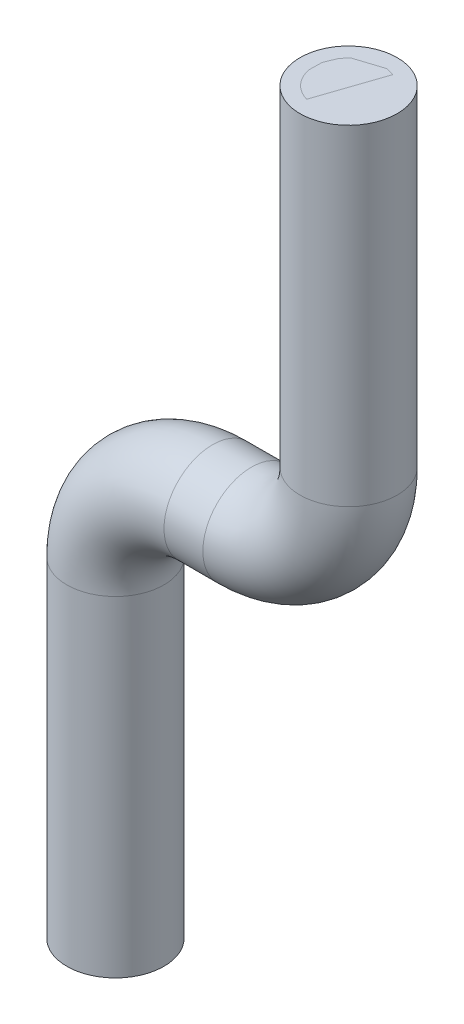
ISO-10303-21;
HEADER;
FILE_DESCRIPTION(('STEP AP214'),'2;1');
FILE_NAME('part.step','',(''),(''),'','','');
FILE_SCHEMA(('AUTOMOTIVE_DESIGN { 1 0 10303 214 1 1 1 1 }'));
ENDSEC;
DATA;
#1=APPLICATION_CONTEXT('core data for automotive mechanical design processes');
#2=APPLICATION_PROTOCOL_DEFINITION('international standard','automotive_design',2000,#1);
#3=PRODUCT_CONTEXT('',#1,'mechanical');
#4=PRODUCT('Part','Part','',(#3));
#5=PRODUCT_RELATED_PRODUCT_CATEGORY('part','',(#4));
#6=PRODUCT_DEFINITION_FORMATION('','',#4);
#7=PRODUCT_DEFINITION_CONTEXT('part definition',#1,'design');
#8=PRODUCT_DEFINITION('design','',#6,#7);
#9=PRODUCT_DEFINITION_SHAPE('','',#8);
#10=(LENGTH_UNIT() NAMED_UNIT(*) SI_UNIT(.MILLI.,.METRE.));
#11=(NAMED_UNIT(*) PLANE_ANGLE_UNIT() SI_UNIT($,.RADIAN.));
#12=(NAMED_UNIT(*) SI_UNIT($,.STERADIAN.) SOLID_ANGLE_UNIT());
#13=UNCERTAINTY_MEASURE_WITH_UNIT(LENGTH_MEASURE(1.E-05),#10,'distance_accuracy_value','');
#14=(GEOMETRIC_REPRESENTATION_CONTEXT(3) GLOBAL_UNCERTAINTY_ASSIGNED_CONTEXT((#13)) GLOBAL_UNIT_ASSIGNED_CONTEXT((#10,
#11,#12)) REPRESENTATION_CONTEXT('',''));
#15=CARTESIAN_POINT('',(0.,0.,0.));
#16=DIRECTION('',(0.,0.,1.));
#17=DIRECTION('',(1.,0.,0.));
#18=AXIS2_PLACEMENT_3D('',#15,#16,#17);
#19=CARTESIAN_POINT('',(-41.4999999999999,-53.75,0.));
#20=DIRECTION('',(0.,-1.,0.));
#21=DIRECTION('',(0.,0.,-1.));
#22=AXIS2_PLACEMENT_3D('',#19,#20,#21);
#23=PLANE('',#22);
#24=CARTESIAN_POINT('',(-41.4999999999999,-53.75,0.));
#25=DIRECTION('',(0.,-1.,0.));
#26=DIRECTION('',(0.,0.,-1.));
#27=AXIS2_PLACEMENT_3D('',#24,#25,#26);
#28=CIRCLE('',#27,3.5);
#29=CARTESIAN_POINT('',(-41.4999999999999,-53.75,-3.5));
#30=VERTEX_POINT('',#29);
#31=EDGE_CURVE('E65',#30,#30,#28,.T.);
#32=ORIENTED_EDGE('',*,*,#31,.T.);
#33=EDGE_LOOP('',(#32));
#34=FACE_BOUND('',#33,.T.);
#35=ADVANCED_FACE('F43',(#34),#23,.T.);
#36=CARTESIAN_POINT('',(-17.4999999999999,34.25,0.));
#37=DIRECTION('',(0.,-1.,0.));
#38=DIRECTION('',(0.,0.,-1.));
#39=AXIS2_PLACEMENT_3D('',#36,#37,#38);
#40=PLANE('',#39);
#41=CARTESIAN_POINT('',(-17.4999999999999,34.25,0.));
#42=DIRECTION('',(0.,-1.,0.));
#43=DIRECTION('',(0.,0.,-1.));
#44=AXIS2_PLACEMENT_3D('',#41,#42,#43);
#45=CIRCLE('',#44,3.5);
#46=CARTESIAN_POINT('',(-17.4999999999999,34.25,-3.5));
#47=VERTEX_POINT('',#46);
#48=EDGE_CURVE('E11',#47,#47,#45,.T.);
#49=ORIENTED_EDGE('',*,*,#48,.F.);
#50=EDGE_LOOP('',(#49));
#51=FACE_BOUND('',#50,.T.);
#52=ADVANCED_FACE('F73',(#51),#40,.F.);
#53=CARTESIAN_POINT('',(-41.4999999999999,-53.75,0.));
#54=DIRECTION('',(0.,1.,0.));
#55=DIRECTION('',(0.,0.,1.));
#56=AXIS2_PLACEMENT_3D('',#53,#54,#55);
#57=CYLINDRICAL_SURFACE('',#56,3.5);
#58=CARTESIAN_POINT('',(-41.4999999999999,-19.7500000000001,0.));
#59=DIRECTION('',(0.,-1.,0.));
#60=DIRECTION('',(0.,0.,-1.));
#61=AXIS2_PLACEMENT_3D('',#58,#59,#60);
#62=CIRCLE('',#61,3.5);
#63=CARTESIAN_POINT('',(-45.0000000000003,-19.7500000000001,0.));
#64=VERTEX_POINT('',#63);
#65=EDGE_CURVE('E62',#64,#64,#62,.T.);
#66=ORIENTED_EDGE('',*,*,#65,.T.);
#67=EDGE_LOOP('',(#66));
#68=FACE_BOUND('',#67,.T.);
#69=ORIENTED_EDGE('',*,*,#31,.F.);
#70=EDGE_LOOP('',(#69));
#71=FACE_BOUND('',#70,.T.);
#72=ADVANCED_FACE('F70',(#68,#71),#57,.T.);
#73=CARTESIAN_POINT('',(-31.4999999999999,-19.75,0.));
#74=DIRECTION('',(0.,0.,-1.));
#75=DIRECTION('',(-1.,0.,0.));
#76=AXIS2_PLACEMENT_3D('',#73,#74,#75);
#77=TOROIDAL_SURFACE('',#76,10.0000000000004,3.5);
#78=CARTESIAN_POINT('',(-31.4999999999998,-9.74999999999998,0.));
#79=DIRECTION('',(-1.,0.,0.));
#80=DIRECTION('',(0.,0.,-1.));
#81=AXIS2_PLACEMENT_3D('',#78,#79,#80);
#82=CIRCLE('',#81,3.5);
#83=CARTESIAN_POINT('',(-31.4999999999998,-6.24999999999961,0.));
#84=VERTEX_POINT('',#83);
#85=EDGE_CURVE('E57',#84,#84,#82,.T.);
#86=CARTESIAN_POINT('',(-31.4999999999999,-19.75,0.));
#87=DIRECTION('',(0.,0.,-1.));
#88=DIRECTION('',(-1.,0.,0.));
#89=AXIS2_PLACEMENT_3D('',#86,#87,#88);
#90=CIRCLE('',#89,13.5000000000004);
#91=EDGE_CURVE('',#64,#84,#90,.T.);
#92=ORIENTED_EDGE('',*,*,#65,.F.);
#93=ORIENTED_EDGE('',*,*,#85,.T.);
#94=ORIENTED_EDGE('',*,*,#91,.T.);
#95=ORIENTED_EDGE('',*,*,#91,.F.);
#96=EDGE_LOOP('',(#92,#94,#93,#95));
#97=FACE_BOUND('',#96,.T.);
#98=ADVANCED_FACE('F72',(#97),#77,.T.);
#99=CARTESIAN_POINT('',(-31.4999999999998,-9.74999999999998,0.));
#100=DIRECTION('',(1.,0.,0.));
#101=DIRECTION('',(0.,0.,-1.));
#102=AXIS2_PLACEMENT_3D('',#99,#100,#101);
#103=CYLINDRICAL_SURFACE('',#102,3.5);
#104=CARTESIAN_POINT('',(-27.5,-9.74999999999998,0.));
#105=DIRECTION('',(-1.,0.,0.));
#106=DIRECTION('',(0.,0.,-1.));
#107=AXIS2_PLACEMENT_3D('',#104,#105,#106);
#108=CIRCLE('',#107,3.5);
#109=CARTESIAN_POINT('',(-27.5,-13.25,0.));
#110=VERTEX_POINT('',#109);
#111=EDGE_CURVE('E53',#110,#110,#108,.T.);
#112=ORIENTED_EDGE('',*,*,#111,.T.);
#113=EDGE_LOOP('',(#112));
#114=FACE_BOUND('',#113,.T.);
#115=ORIENTED_EDGE('',*,*,#85,.F.);
#116=EDGE_LOOP('',(#115));
#117=FACE_BOUND('',#116,.T.);
#118=ADVANCED_FACE('F80',(#114,#117),#103,.T.);
#119=CARTESIAN_POINT('',(-27.4999999999999,0.250000000000016,0.));
#120=DIRECTION('',(0.,0.,1.));
#121=DIRECTION('',(1.,0.,0.));
#122=AXIS2_PLACEMENT_3D('',#119,#120,#121);
#123=TOROIDAL_SURFACE('',#122,10.,3.5);
#124=CARTESIAN_POINT('',(-17.4999999999999,0.250000000000014,0.));
#125=DIRECTION('',(0.,-1.,0.));
#126=DIRECTION('',(0.,0.,-1.));
#127=AXIS2_PLACEMENT_3D('',#124,#125,#126);
#128=CIRCLE('',#127,3.5);
#129=CARTESIAN_POINT('',(-13.9999999999999,0.250000000000013,0.));
#130=VERTEX_POINT('',#129);
#131=EDGE_CURVE('E49',#130,#130,#128,.T.);
#132=CARTESIAN_POINT('',(-27.4999999999999,0.250000000000016,0.));
#133=DIRECTION('',(0.,0.,1.));
#134=DIRECTION('',(1.,0.,0.));
#135=AXIS2_PLACEMENT_3D('',#132,#133,#134);
#136=CIRCLE('',#135,13.5);
#137=EDGE_CURVE('',#110,#130,#136,.T.);
#138=ORIENTED_EDGE('',*,*,#111,.F.);
#139=ORIENTED_EDGE('',*,*,#131,.T.);
#140=ORIENTED_EDGE('',*,*,#137,.T.);
#141=ORIENTED_EDGE('',*,*,#137,.F.);
#142=EDGE_LOOP('',(#138,#140,#139,#141));
#143=FACE_BOUND('',#142,.T.);
#144=ADVANCED_FACE('F86',(#143),#123,.T.);
#145=CARTESIAN_POINT('',(-17.4999999999999,0.250000000000014,0.));
#146=DIRECTION('',(0.,1.,0.));
#147=DIRECTION('',(0.,0.,1.));
#148=AXIS2_PLACEMENT_3D('',#145,#146,#147);
#149=CYLINDRICAL_SURFACE('',#148,3.5);
#150=ORIENTED_EDGE('',*,*,#48,.T.);
#151=EDGE_LOOP('',(#150));
#152=FACE_BOUND('',#151,.T.);
#153=ORIENTED_EDGE('',*,*,#131,.F.);
#154=EDGE_LOOP('',(#153));
#155=FACE_BOUND('',#154,.T.);
#156=ADVANCED_FACE('F84',(#152,#155),#149,.T.);
#157=CLOSED_SHELL('',(#35,#52,#72,#98,#118,#144,#156));
#158=MANIFOLD_SOLID_BREP('B2',#157);
#159=CARTESIAN_POINT('',(-41.4999999999999,-53.75,0.));
#160=DIRECTION('',(0.,-1.,0.));
#161=DIRECTION('',(0.,0.,-1.));
#162=AXIS2_PLACEMENT_3D('',#159,#160,#161);
#163=PLANE('',#162);
#164=CARTESIAN_POINT('',(-41.4999999999999,-53.75,0.));
#165=DIRECTION('',(0.,-1.,0.));
#166=DIRECTION('',(0.,0.,-1.));
#167=AXIS2_PLACEMENT_3D('',#164,#165,#166);
#168=CIRCLE('',#167,5.);
#169=CARTESIAN_POINT('',(-41.4999999999999,-53.75,-5.));
#170=VERTEX_POINT('',#169);
#171=EDGE_CURVE('E166',#170,#170,#168,.T.);
#172=ORIENTED_EDGE('',*,*,#171,.T.);
#173=EDGE_LOOP('',(#172));
#174=FACE_BOUND('',#173,.T.);
#175=ADVANCED_FACE('F144',(#174),#163,.T.);
#176=CARTESIAN_POINT('',(-17.4999999999999,34.25,0.));
#177=DIRECTION('',(0.,-1.,0.));
#178=DIRECTION('',(0.,0.,-1.));
#179=AXIS2_PLACEMENT_3D('',#176,#177,#178);
#180=PLANE('',#179);
#181=CARTESIAN_POINT('',(-17.4999999999999,34.25,0.));
#182=DIRECTION('',(0.,-1.,0.));
#183=DIRECTION('',(0.,0.,-1.));
#184=AXIS2_PLACEMENT_3D('',#181,#182,#183);
#185=CIRCLE('',#184,5.);
#186=CARTESIAN_POINT('',(-17.4999999999999,34.25,-5.));
#187=VERTEX_POINT('',#186);
#188=EDGE_CURVE('E42',#187,#187,#185,.T.);
#189=ORIENTED_EDGE('',*,*,#188,.F.);
#190=EDGE_LOOP('',(#189));
#191=FACE_BOUND('',#190,.T.);
#192=ADVANCED_FACE('F174',(#191),#180,.F.);
#193=CARTESIAN_POINT('',(-41.4999999999999,-53.75,0.));
#194=DIRECTION('',(0.,1.,0.));
#195=DIRECTION('',(0.,0.,1.));
#196=AXIS2_PLACEMENT_3D('',#193,#194,#195);
#197=CYLINDRICAL_SURFACE('',#196,5.);
#198=CARTESIAN_POINT('',(-41.4999999999999,-19.7500000000001,0.));
#199=DIRECTION('',(0.,-1.,0.));
#200=DIRECTION('',(0.,0.,-1.));
#201=AXIS2_PLACEMENT_3D('',#198,#199,#200);
#202=CIRCLE('',#201,5.);
#203=CARTESIAN_POINT('',(-46.5000000000003,-19.7500000000001,0.));
#204=VERTEX_POINT('',#203);
#205=EDGE_CURVE('E163',#204,#204,#202,.T.);
#206=ORIENTED_EDGE('',*,*,#205,.T.);
#207=EDGE_LOOP('',(#206));
#208=FACE_BOUND('',#207,.T.);
#209=ORIENTED_EDGE('',*,*,#171,.F.);
#210=EDGE_LOOP('',(#209));
#211=FACE_BOUND('',#210,.T.);
#212=ADVANCED_FACE('F171',(#208,#211),#197,.T.);
#213=CARTESIAN_POINT('',(-31.4999999999999,-19.75,0.));
#214=DIRECTION('',(0.,0.,-1.));
#215=DIRECTION('',(-1.,0.,0.));
#216=AXIS2_PLACEMENT_3D('',#213,#214,#215);
#217=TOROIDAL_SURFACE('',#216,10.0000000000004,5.);
#218=CARTESIAN_POINT('',(-31.4999999999998,-9.74999999999998,0.));
#219=DIRECTION('',(-1.,0.,0.));
#220=DIRECTION('',(0.,0.,-1.));
#221=AXIS2_PLACEMENT_3D('',#218,#219,#220);
#222=CIRCLE('',#221,5.);
#223=CARTESIAN_POINT('',(-31.4999999999998,-4.74999999999961,0.));
#224=VERTEX_POINT('',#223);
#225=EDGE_CURVE('E158',#224,#224,#222,.T.);
#226=CARTESIAN_POINT('',(-31.4999999999999,-19.75,0.));
#227=DIRECTION('',(0.,0.,-1.));
#228=DIRECTION('',(-1.,0.,0.));
#229=AXIS2_PLACEMENT_3D('',#226,#227,#228);
#230=CIRCLE('',#229,15.0000000000004);
#231=EDGE_CURVE('',#204,#224,#230,.T.);
#232=ORIENTED_EDGE('',*,*,#205,.F.);
#233=ORIENTED_EDGE('',*,*,#225,.T.);
#234=ORIENTED_EDGE('',*,*,#231,.T.);
#235=ORIENTED_EDGE('',*,*,#231,.F.);
#236=EDGE_LOOP('',(#232,#234,#233,#235));
#237=FACE_BOUND('',#236,.T.);
#238=ADVANCED_FACE('F173',(#237),#217,.T.);
#239=CARTESIAN_POINT('',(-31.4999999999998,-9.74999999999998,0.));
#240=DIRECTION('',(1.,0.,0.));
#241=DIRECTION('',(0.,0.,-1.));
#242=AXIS2_PLACEMENT_3D('',#239,#240,#241);
#243=CYLINDRICAL_SURFACE('',#242,5.);
#244=CARTESIAN_POINT('',(-27.5,-9.74999999999998,0.));
#245=DIRECTION('',(-1.,0.,0.));
#246=DIRECTION('',(0.,0.,-1.));
#247=AXIS2_PLACEMENT_3D('',#244,#245,#246);
#248=CIRCLE('',#247,5.);
#249=CARTESIAN_POINT('',(-27.5,-14.75,0.));
#250=VERTEX_POINT('',#249);
#251=EDGE_CURVE('E154',#250,#250,#248,.T.);
#252=ORIENTED_EDGE('',*,*,#251,.T.);
#253=EDGE_LOOP('',(#252));
#254=FACE_BOUND('',#253,.T.);
#255=ORIENTED_EDGE('',*,*,#225,.F.);
#256=EDGE_LOOP('',(#255));
#257=FACE_BOUND('',#256,.T.);
#258=ADVANCED_FACE('F181',(#254,#257),#243,.T.);
#259=CARTESIAN_POINT('',(-27.4999999999999,0.250000000000016,0.));
#260=DIRECTION('',(0.,0.,1.));
#261=DIRECTION('',(1.,0.,0.));
#262=AXIS2_PLACEMENT_3D('',#259,#260,#261);
#263=TOROIDAL_SURFACE('',#262,10.,5.);
#264=CARTESIAN_POINT('',(-17.4999999999999,0.250000000000014,0.));
#265=DIRECTION('',(0.,-1.,0.));
#266=DIRECTION('',(0.,0.,-1.));
#267=AXIS2_PLACEMENT_3D('',#264,#265,#266);
#268=CIRCLE('',#267,5.);
#269=CARTESIAN_POINT('',(-12.4999999999999,0.250000000000013,0.));
#270=VERTEX_POINT('',#269);
#271=EDGE_CURVE('E150',#270,#270,#268,.T.);
#272=CARTESIAN_POINT('',(-27.4999999999999,0.250000000000016,0.));
#273=DIRECTION('',(0.,0.,1.));
#274=DIRECTION('',(1.,0.,0.));
#275=AXIS2_PLACEMENT_3D('',#272,#273,#274);
#276=CIRCLE('',#275,15.);
#277=EDGE_CURVE('',#250,#270,#276,.T.);
#278=ORIENTED_EDGE('',*,*,#251,.F.);
#279=ORIENTED_EDGE('',*,*,#271,.T.);
#280=ORIENTED_EDGE('',*,*,#277,.T.);
#281=ORIENTED_EDGE('',*,*,#277,.F.);
#282=EDGE_LOOP('',(#278,#280,#279,#281));
#283=FACE_BOUND('',#282,.T.);
#284=ADVANCED_FACE('F187',(#283),#263,.T.);
#285=CARTESIAN_POINT('',(-17.4999999999999,0.250000000000014,0.));
#286=DIRECTION('',(0.,1.,0.));
#287=DIRECTION('',(0.,0.,1.));
#288=AXIS2_PLACEMENT_3D('',#285,#286,#287);
#289=CYLINDRICAL_SURFACE('',#288,5.);
#290=ORIENTED_EDGE('',*,*,#188,.T.);
#291=EDGE_LOOP('',(#290));
#292=FACE_BOUND('',#291,.T.);
#293=ORIENTED_EDGE('',*,*,#271,.F.);
#294=EDGE_LOOP('',(#293));
#295=FACE_BOUND('',#294,.T.);
#296=ADVANCED_FACE('F185',(#292,#295),#289,.T.);
#297=CLOSED_SHELL('',(#175,#192,#212,#238,#258,#284,#296));
#298=MANIFOLD_SOLID_BREP('B6',#297);
#299=ADVANCED_BREP_SHAPE_REPRESENTATION('',(#18,#158,#298),#14);
#300=SHAPE_DEFINITION_REPRESENTATION(#9,#299);
ENDSEC;
END-ISO-10303-21;
